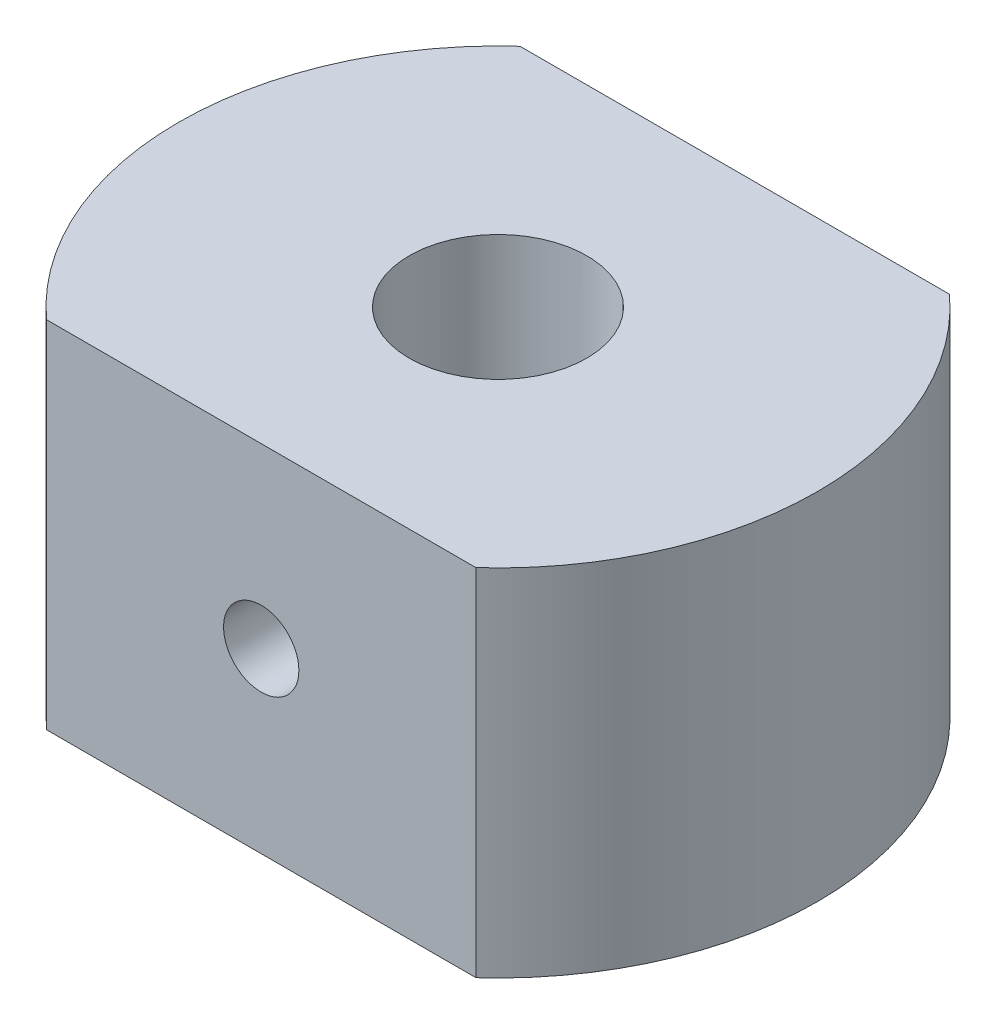
ISO-10303-21;
HEADER;
FILE_DESCRIPTION(('STEP AP214'),'2;1');
FILE_NAME('part.step','',(''),(''),'','','');
FILE_SCHEMA(('AUTOMOTIVE_DESIGN { 1 0 10303 214 1 1 1 1 }'));
ENDSEC;
DATA;
#1=APPLICATION_CONTEXT('core data for automotive mechanical design processes');
#2=APPLICATION_PROTOCOL_DEFINITION('international standard','automotive_design',2000,#1);
#3=PRODUCT_CONTEXT('',#1,'mechanical');
#4=PRODUCT('Part','Part','',(#3));
#5=PRODUCT_RELATED_PRODUCT_CATEGORY('part','',(#4));
#6=PRODUCT_DEFINITION_FORMATION('','',#4);
#7=PRODUCT_DEFINITION_CONTEXT('part definition',#1,'design');
#8=PRODUCT_DEFINITION('design','',#6,#7);
#9=PRODUCT_DEFINITION_SHAPE('','',#8);
#10=(LENGTH_UNIT() NAMED_UNIT(*) SI_UNIT(.MILLI.,.METRE.));
#11=(NAMED_UNIT(*) PLANE_ANGLE_UNIT() SI_UNIT($,.RADIAN.));
#12=(NAMED_UNIT(*) SI_UNIT($,.STERADIAN.) SOLID_ANGLE_UNIT());
#13=UNCERTAINTY_MEASURE_WITH_UNIT(LENGTH_MEASURE(1.E-05),#10,'distance_accuracy_value','');
#14=(GEOMETRIC_REPRESENTATION_CONTEXT(3) GLOBAL_UNCERTAINTY_ASSIGNED_CONTEXT((#13)) GLOBAL_UNIT_ASSIGNED_CONTEXT((#10,
#11,#12)) REPRESENTATION_CONTEXT('',''));
#15=CARTESIAN_POINT('',(0.,0.,0.));
#16=DIRECTION('',(0.,0.,1.));
#17=DIRECTION('',(1.,0.,0.));
#18=AXIS2_PLACEMENT_3D('',#15,#16,#17);
#19=CARTESIAN_POINT('',(0.,19.05,0.));
#20=DIRECTION('',(0.,-1.,0.));
#21=DIRECTION('',(0.,0.,-1.));
#22=AXIS2_PLACEMENT_3D('',#19,#20,#21);
#23=CYLINDRICAL_SURFACE('',#22,17.145);
#24=DIRECTION('',(0.,-1.,0.));
#25=VECTOR('',#24,1.);
#26=CARTESIAN_POINT('',(11.5178567884828,19.05,-12.7));
#27=LINE('',#26,#25);
#28=CARTESIAN_POINT('',(11.5178567884828,19.05,-12.7));
#29=VERTEX_POINT('',#28);
#30=CARTESIAN_POINT('',(11.5178567884828,0.,-12.7));
#31=VERTEX_POINT('',#30);
#32=EDGE_CURVE('E100',#29,#31,#27,.T.);
#33=ORIENTED_EDGE('',*,*,#32,.F.);
#34=CARTESIAN_POINT('',(0.,19.05,0.));
#35=DIRECTION('',(0.,1.,0.));
#36=DIRECTION('',(0.,0.,1.));
#37=AXIS2_PLACEMENT_3D('',#34,#35,#36);
#38=CIRCLE('',#37,17.145);
#39=CARTESIAN_POINT('',(11.5178567884828,19.05,12.7));
#40=VERTEX_POINT('',#39);
#41=EDGE_CURVE('E12',#40,#29,#38,.T.);
#42=ORIENTED_EDGE('',*,*,#41,.F.);
#43=DIRECTION('',(0.,-1.,0.));
#44=VECTOR('',#43,1.);
#45=CARTESIAN_POINT('',(11.5178567884828,19.05,12.7));
#46=LINE('',#45,#44);
#47=CARTESIAN_POINT('',(11.5178567884828,0.,12.7));
#48=VERTEX_POINT('',#47);
#49=EDGE_CURVE('E89',#48,#40,#46,.F.);
#50=ORIENTED_EDGE('',*,*,#49,.F.);
#51=CARTESIAN_POINT('',(0.,0.,0.));
#52=DIRECTION('',(0.,1.,0.));
#53=DIRECTION('',(0.,0.,1.));
#54=AXIS2_PLACEMENT_3D('',#51,#52,#53);
#55=CIRCLE('',#54,17.145);
#56=EDGE_CURVE('E57',#48,#31,#55,.T.);
#57=ORIENTED_EDGE('',*,*,#56,.T.);
#58=EDGE_LOOP('',(#33,#42,#50,#57));
#59=FACE_BOUND('',#58,.T.);
#60=ADVANCED_FACE('F33',(#59),#23,.T.);
#61=CARTESIAN_POINT('',(-11.5178567884828,0.,-12.7));
#62=VERTEX_POINT('',#61);
#63=CARTESIAN_POINT('',(-11.5178567884828,0.,12.7));
#64=VERTEX_POINT('',#63);
#65=EDGE_CURVE('E49',#62,#64,#55,.T.);
#66=ORIENTED_EDGE('',*,*,#65,.T.);
#67=DIRECTION('',(0.,-1.,0.));
#68=VECTOR('',#67,1.);
#69=CARTESIAN_POINT('',(-11.5178567884828,19.05,12.7));
#70=LINE('',#69,#68);
#71=CARTESIAN_POINT('',(-11.5178567884828,19.05,12.7));
#72=VERTEX_POINT('',#71);
#73=EDGE_CURVE('E87',#72,#64,#70,.T.);
#74=ORIENTED_EDGE('',*,*,#73,.F.);
#75=CARTESIAN_POINT('',(-11.5178567884828,19.05,-12.7));
#76=VERTEX_POINT('',#75);
#77=EDGE_CURVE('E41',#76,#72,#38,.T.);
#78=ORIENTED_EDGE('',*,*,#77,.F.);
#79=DIRECTION('',(0.,-1.,0.));
#80=VECTOR('',#79,1.);
#81=CARTESIAN_POINT('',(-11.5178567884828,19.05,-12.7));
#82=LINE('',#81,#80);
#83=EDGE_CURVE('E95',#62,#76,#82,.F.);
#84=ORIENTED_EDGE('',*,*,#83,.F.);
#85=EDGE_LOOP('',(#66,#74,#78,#84));
#86=FACE_BOUND('',#85,.T.);
#87=ADVANCED_FACE('F92',(#86),#23,.T.);
#88=CARTESIAN_POINT('',(0.,19.05,0.));
#89=DIRECTION('',(0.,1.,0.));
#90=DIRECTION('',(0.,0.,1.));
#91=AXIS2_PLACEMENT_3D('',#88,#89,#90);
#92=PLANE('',#91);
#93=CARTESIAN_POINT('',(0.,19.05,0.));
#94=DIRECTION('',(0.,1.,0.));
#95=DIRECTION('',(0.,0.,1.));
#96=AXIS2_PLACEMENT_3D('',#93,#94,#95);
#97=CIRCLE('',#96,4.7625);
#98=CARTESIAN_POINT('',(0.,19.05,4.7625));
#99=VERTEX_POINT('',#98);
#100=EDGE_CURVE('E106',#99,#99,#97,.T.);
#101=ORIENTED_EDGE('',*,*,#100,.F.);
#102=EDGE_LOOP('',(#101));
#103=FACE_BOUND('',#102,.T.);
#104=ORIENTED_EDGE('',*,*,#77,.T.);
#105=DIRECTION('',(1.,0.,0.));
#106=VECTOR('',#105,1.);
#107=CARTESIAN_POINT('',(-17.145,19.05,12.7));
#108=LINE('',#107,#106);
#109=EDGE_CURVE('E81',#72,#40,#108,.T.);
#110=ORIENTED_EDGE('',*,*,#109,.T.);
#111=ORIENTED_EDGE('',*,*,#41,.T.);
#112=DIRECTION('',(-1.,0.,0.));
#113=VECTOR('',#112,1.);
#114=CARTESIAN_POINT('',(-17.145,19.05,-12.7));
#115=LINE('',#114,#113);
#116=EDGE_CURVE('E84',#29,#76,#115,.T.);
#117=ORIENTED_EDGE('',*,*,#116,.T.);
#118=EDGE_LOOP('',(#104,#110,#111,#117));
#119=FACE_BOUND('',#118,.T.);
#120=ADVANCED_FACE('F80',(#103,#119),#92,.T.);
#121=CARTESIAN_POINT('',(0.,0.,0.));
#122=DIRECTION('',(0.,1.,0.));
#123=DIRECTION('',(0.,0.,1.));
#124=AXIS2_PLACEMENT_3D('',#121,#122,#123);
#125=PLANE('',#124);
#126=CARTESIAN_POINT('',(0.,0.,0.));
#127=DIRECTION('',(0.,1.,0.));
#128=DIRECTION('',(0.,0.,1.));
#129=AXIS2_PLACEMENT_3D('',#126,#127,#128);
#130=CIRCLE('',#129,4.7625);
#131=CARTESIAN_POINT('',(0.,0.,4.7625));
#132=VERTEX_POINT('',#131);
#133=EDGE_CURVE('E103',#132,#132,#130,.T.);
#134=ORIENTED_EDGE('',*,*,#133,.T.);
#135=EDGE_LOOP('',(#134));
#136=FACE_BOUND('',#135,.T.);
#137=DIRECTION('',(1.,0.,0.));
#138=VECTOR('',#137,1.);
#139=CARTESIAN_POINT('',(-17.145,0.,12.7));
#140=LINE('',#139,#138);
#141=EDGE_CURVE('E150',#64,#48,#140,.T.);
#142=ORIENTED_EDGE('',*,*,#141,.F.);
#143=ORIENTED_EDGE('',*,*,#65,.F.);
#144=DIRECTION('',(-1.,0.,0.));
#145=VECTOR('',#144,1.);
#146=CARTESIAN_POINT('',(-17.145,0.,-12.7));
#147=LINE('',#146,#145);
#148=EDGE_CURVE('E90',#31,#62,#147,.T.);
#149=ORIENTED_EDGE('',*,*,#148,.F.);
#150=ORIENTED_EDGE('',*,*,#56,.F.);
#151=EDGE_LOOP('',(#142,#143,#149,#150));
#152=FACE_BOUND('',#151,.T.);
#153=ADVANCED_FACE('F129',(#136,#152),#125,.F.);
#154=CARTESIAN_POINT('',(0.,9.525,-50.8));
#155=DIRECTION('',(0.,0.,1.));
#156=DIRECTION('',(1.,0.,0.));
#157=AXIS2_PLACEMENT_3D('',#154,#155,#156);
#158=CYLINDRICAL_SURFACE('',#157,2.0193);
#159=CARTESIAN_POINT('',(2.0193,9.525,-4.31321617357627));
#160=CARTESIAN_POINT('',(2.01929110374706,9.41748293676407,-4.31322500784682));
#161=CARTESIAN_POINT('',(2.01066084321028,9.30981288717604,-4.31729359492948));
#162=CARTESIAN_POINT('',(1.9764874964569,9.0975843370201,-4.33304009826462));
#163=CARTESIAN_POINT('',(1.95089924154244,8.99303492780961,-4.34473833525082));
#164=CARTESIAN_POINT('',(1.88399287898184,8.79051625775393,-4.37416225736717));
#165=CARTESIAN_POINT('',(1.8427404411322,8.69252150773558,-4.39186274624098));
#166=CARTESIAN_POINT('',(1.74587105896644,8.5048702073747,-4.43125985982862));
#167=CARTESIAN_POINT('',(1.69025715777373,8.4152118960491,-4.45295563768131));
#168=CARTESIAN_POINT('',(1.56240981495982,8.24094496246386,-4.49946283082396));
#169=CARTESIAN_POINT('',(1.48939451991757,8.15693848026367,-4.52438225881611));
#170=CARTESIAN_POINT('',(1.330457633739,8.00191576149239,-4.57364273721066));
#171=CARTESIAN_POINT('',(1.24453098650334,7.93090463818724,-4.59798355668516));
#172=CARTESIAN_POINT('',(1.0574437221698,7.8007784739908,-4.64466510279087));
#173=CARTESIAN_POINT('',(0.955770116211584,7.74234612873677,-4.66686571564726));
#174=CARTESIAN_POINT('',(0.742924215302888,7.64367685940121,-4.70543723475685));
#175=CARTESIAN_POINT('',(0.631756306881607,7.60343158607765,-4.72181081532365));
#176=CARTESIAN_POINT('',(0.409404370247119,7.54447735285553,-4.74611649179893));
#177=CARTESIAN_POINT('',(0.298541296141911,7.52472864691372,-4.75445440769268));
#178=CARTESIAN_POINT('',(0.0747825744101491,7.50396320047014,-4.76322673343662));
#179=CARTESIAN_POINT('',(-0.0381121976817063,7.50293857579909,-4.76366446982302));
#180=CARTESIAN_POINT('',(-0.255149328927894,7.51911700773496,-4.75682237766575));
#181=CARTESIAN_POINT('',(-0.359395126584831,7.53517617043442,-4.75002685606835));
#182=CARTESIAN_POINT('',(-0.563549103242388,7.58309852009277,-4.73015241176738));
#183=CARTESIAN_POINT('',(-0.663456961366336,7.6149628740005,-4.71707302510779));
#184=CARTESIAN_POINT('',(-0.857941199933671,7.69396237504655,-4.68563802872959));
#185=CARTESIAN_POINT('',(-0.952412672092121,7.74132361969344,-4.66720478405573));
#186=CARTESIAN_POINT('',(-1.13231541138298,7.84974608544132,-4.6268542768475));
#187=CARTESIAN_POINT('',(-1.21774343330275,7.91081220012941,-4.60493577065043));
#188=CARTESIAN_POINT('',(-1.38372923627481,8.05006375589506,-4.55792414045136));
#189=CARTESIAN_POINT('',(-1.46348272400714,8.12917040691293,-4.53271606660081));
#190=CARTESIAN_POINT('',(-1.60894685440403,8.29967212917618,-4.48314781333981));
#191=CARTESIAN_POINT('',(-1.67465168761736,8.39107225871288,-4.45878798817258));
#192=CARTESIAN_POINT('',(-1.79232295549791,8.58760165210156,-4.41283628949927));
#193=CARTESIAN_POINT('',(-1.84372708516444,8.6930998590068,-4.39137137236525));
#194=CARTESIAN_POINT('',(-1.9277086586156,8.91240631115646,-4.35516493590615));
#195=CARTESIAN_POINT('',(-1.96030011961023,9.02620829789978,-4.3404184124759));
#196=CARTESIAN_POINT('',(-2.00364610196248,9.25082202551601,-4.32057213659523));
#197=CARTESIAN_POINT('',(-2.01570844648017,9.3613294996527,-4.31489617703));
#198=CARTESIAN_POINT('',(-2.02150656229295,9.58291161968081,-4.31218443971668));
#199=CARTESIAN_POINT('',(-2.01524905836858,9.69398604251648,-4.31514549152573));
#200=CARTESIAN_POINT('',(-1.9857796717503,9.9056614711017,-4.32877712450799));
#201=CARTESIAN_POINT('',(-1.96373770351057,10.0064641129133,-4.33891519563437));
#202=CARTESIAN_POINT('',(-1.90489016269096,10.2028496477121,-4.36506914722584));
#203=CARTESIAN_POINT('',(-1.86808105688066,10.2984312852832,-4.381086434292));
#204=CARTESIAN_POINT('',(-1.7789908783356,10.4862663213644,-4.41803252929292));
#205=CARTESIAN_POINT('',(-1.72611180959561,10.5781991600938,-4.43914313531064));
#206=CARTESIAN_POINT('',(-1.60697058668266,10.7523384317747,-4.48364716457098));
#207=CARTESIAN_POINT('',(-1.54070249758578,10.8345405256823,-4.50704159777595));
#208=CARTESIAN_POINT('',(-1.39003959599186,10.9941497616923,-4.55587269406364));
#209=CARTESIAN_POINT('',(-1.3045836788228,11.0705578254153,-4.58131416933741));
#210=CARTESIAN_POINT('',(-1.12148339258769,11.2081398260767,-4.62953940477662));
#211=CARTESIAN_POINT('',(-1.02383793452483,11.2693124004333,-4.65232292713195));
#212=CARTESIAN_POINT('',(-0.818267914714745,11.3747015311528,-4.69285075220315));
#213=CARTESIAN_POINT('',(-0.710304055855965,11.4188497565086,-4.7105746747205));
#214=CARTESIAN_POINT('',(-0.487534115112742,11.4880238090711,-4.73880672086256));
#215=CARTESIAN_POINT('',(-0.372732313699731,11.5130614664252,-4.74931930816122));
#216=CARTESIAN_POINT('',(-0.148458396260826,11.5417756534458,-4.76141429209498));
#217=CARTESIAN_POINT('',(-0.0391969897359826,11.5468593014407,-4.76358471090499));
#218=CARTESIAN_POINT('',(0.178590408357317,11.539334380364,-4.76039525956455));
#219=CARTESIAN_POINT('',(0.287116533300415,11.5267291112262,-4.75503679395547));
#220=CARTESIAN_POINT('',(0.496125818541556,11.4851943333834,-4.73770629072151));
#221=CARTESIAN_POINT('',(0.59675795115101,11.4568982085649,-4.72599121869625));
#222=CARTESIAN_POINT('',(0.791799077661536,11.3854888154771,-4.6972531473272));
#223=CARTESIAN_POINT('',(0.886206907721936,11.3423727854449,-4.68022915869533));
#224=CARTESIAN_POINT('',(1.07085614019074,11.2403621860006,-4.64154895995872));
#225=CARTESIAN_POINT('',(1.16071269721103,11.1808391165402,-4.61971726995918));
#226=CARTESIAN_POINT('',(1.32954960213056,11.0486079500004,-4.57398811422751));
#227=CARTESIAN_POINT('',(1.40852572409303,10.9758947551653,-4.55008985167607));
#228=CARTESIAN_POINT('',(1.55918807882057,10.8132695680987,-4.50078467784592));
#229=CARTESIAN_POINT('',(1.62996109431015,10.722503932803,-4.475390870962));
#230=CARTESIAN_POINT('',(1.75542098130221,10.5296491447899,-4.42768799065369));
#231=CARTESIAN_POINT('',(1.81009864713684,10.4275535577385,-4.40538068639169));
#232=CARTESIAN_POINT('',(1.90134539479181,10.2147634653175,-4.36678027546454));
#233=CARTESIAN_POINT('',(1.93797277217725,10.1040979953562,-4.35046785160002));
#234=CARTESIAN_POINT('',(1.97824929459729,9.93426421332426,-4.33222071890415));
#235=CARTESIAN_POINT('',(1.9892271714489,9.87707064249135,-4.32717713250279));
#236=CARTESIAN_POINT('',(2.00620922974136,9.76180790153603,-4.31933158243512));
#237=CARTESIAN_POINT('',(2.01221681584378,9.7037393585805,-4.31652808434782));
#238=CARTESIAN_POINT('',(2.0181008333919,9.60539799058151,-4.3137773801375));
#239=CARTESIAN_POINT('',(2.01930332705896,9.56520969395213,-4.31321286969775));
#240=CARTESIAN_POINT('',(2.0193,9.525,-4.31321617357627));
#241=B_SPLINE_CURVE_WITH_KNOTS('',3,(#159,#160,#161,#162,#163,#164,#165,#166,#167,#168,#169,
#170,#171,#172,#173,#174,#175,#176,#177,#178,#179,#180,#181,#182,#183,#184,#185,#186,#187,#188,
#189,#190,#191,#192,#193,#194,#195,#196,#197,#198,#199,#200,#201,#202,#203,#204,#205,#206,#207,
#208,#209,#210,#211,#212,#213,#214,#215,#216,#217,#218,#219,#220,#221,#222,#223,#224,#225,#226,
#227,#228,#229,#230,#231,#232,#233,#234,#235,#236,#237,#238,#239,#240),.UNSPECIFIED.,.T.,.F.,(4,
2,2,2,2,2,2,2,2,2,2,2,2,2,2,2,2,2,2,2,2,2,2,2,2,2,2,2,2,2,2,2,2,2,2,2,2,2,2,2,4),(0.,
0.32240774760739,0.64567771886989,0.967607129297546,1.28946838036161,1.63015644524804,
1.97097827332822,2.32720365041864,2.6832653265655,3.02022094974152,3.35703468737582,
3.6726362923118,3.98826120261347,4.30871326427277,4.62927993206324,4.97312796410058,
5.31711791161203,5.67316574899681,6.02894795362536,6.36107482373721,6.6930797932642,
7.00273070387431,7.31245574673447,7.63551813438923,7.95872404067676,8.30936105230238,
8.66002941180441,9.01209095971419,9.36393439137057,9.69046664672362,10.0169379943581,
10.3311005347481,10.6453216526569,10.9738355236538,11.302476631146,11.654407125061,
12.0065385147928,12.3575250768451,12.5326811204118,12.707717082077,12.8282925188395),.UNSPECIFIED.);
#242=CARTESIAN_POINT('',(2.0193,9.525,-4.31321617357627));
#243=VERTEX_POINT('',#242);
#244=EDGE_CURVE('E102',#243,#243,#241,.T.);
#245=ORIENTED_EDGE('',*,*,#244,.F.);
#246=EDGE_LOOP('',(#245));
#247=FACE_BOUND('',#246,.T.);
#248=CARTESIAN_POINT('',(0.,9.525,-12.7));
#249=DIRECTION('',(0.,0.,-1.));
#250=DIRECTION('',(-1.,0.,0.));
#251=AXIS2_PLACEMENT_3D('',#248,#249,#250);
#252=CIRCLE('',#251,2.0193);
#253=CARTESIAN_POINT('',(-2.0193,9.525,-12.7));
#254=VERTEX_POINT('',#253);
#255=EDGE_CURVE('E36',#254,#254,#252,.F.);
#256=ORIENTED_EDGE('',*,*,#255,.F.);
#257=EDGE_LOOP('',(#256));
#258=FACE_BOUND('',#257,.T.);
#259=ADVANCED_FACE('F124',(#247,#258),#158,.F.);
#260=CARTESIAN_POINT('',(0.,7.5057,4.7625));
#261=CARTESIAN_POINT('',(0.107991496567345,7.5057041480405,4.76249669402768));
#262=CARTESIAN_POINT('',(0.216165198546214,7.51441393253757,4.75878535447878));
#263=CARTESIAN_POINT('',(0.429428346869618,7.54892090106755,4.74431067948027));
#264=CARTESIAN_POINT('',(0.534509183763363,7.57476179438442,4.73352930590862));
#265=CARTESIAN_POINT('',(0.738163416215698,7.64240706158452,4.70606441294083));
#266=CARTESIAN_POINT('',(0.836757822880156,7.68415658070965,4.68940118921749));
#267=CARTESIAN_POINT('',(1.02544436154111,7.78220100146872,4.65178867166375));
#268=CARTESIAN_POINT('',(1.1155388918147,7.83849178336452,4.63084059214083));
#269=CARTESIAN_POINT('',(1.28946535231427,7.96708695297789,4.58553597200015));
#270=CARTESIAN_POINT('',(1.37280136324168,8.04002149220087,4.56106525895698));
#271=CARTESIAN_POINT('',(1.52648801066348,8.19850005411637,4.51195772900846));
#272=CARTESIAN_POINT('',(1.59683158330901,8.28405089096419,4.48732082924961));
#273=CARTESIAN_POINT('',(1.72611202218087,8.47065666950489,4.4392509382189));
#274=CARTESIAN_POINT('',(1.78427731424354,8.57228229303612,4.41594480218955));
#275=CARTESIAN_POINT('',(1.88246665391315,8.78500430808006,4.37499449073841));
#276=CARTESIAN_POINT('',(1.92250037350019,8.89609561261854,4.35734729811954));
#277=CARTESIAN_POINT('',(1.98122377300505,9.11888641284391,4.3309531231867));
#278=CARTESIAN_POINT('',(2.00086975624937,9.23028502454521,4.32180969878174));
#279=CARTESIAN_POINT('',(2.02124136622949,9.45514386106173,4.3123229792902));
#280=CARTESIAN_POINT('',(2.02197796722129,9.56860285184857,4.31197457992163));
#281=CARTESIAN_POINT('',(2.00522829749944,9.78467659983735,4.31978298249343));
#282=CARTESIAN_POINT('',(1.98919364958509,9.88743336002839,4.32726229471122));
#283=CARTESIAN_POINT('',(1.94179809180933,10.088630293751,4.34873499411435));
#284=CARTESIAN_POINT('',(1.91043412230728,10.1870696012687,4.36272968170305));
#285=CARTESIAN_POINT('',(1.8326543897409,10.3793681765338,4.39597534219583));
#286=CARTESIAN_POINT('',(1.78592779932577,10.4730823671011,4.41533343757528));
#287=CARTESIAN_POINT('',(1.67896983107483,10.6517126536838,4.45710193306763));
#288=CARTESIAN_POINT('',(1.61873302403147,10.7366251925587,4.47951355884522));
#289=CARTESIAN_POINT('',(1.48025856784974,10.903089731251,4.52725679952809));
#290=CARTESIAN_POINT('',(1.40090473830624,10.9836919450158,4.5526720133063));
#291=CARTESIAN_POINT('',(1.22956364352471,11.1307698434973,4.60190395122921));
#292=CARTESIAN_POINT('',(1.13757321647958,11.197241982086,4.62572027308737));
#293=CARTESIAN_POINT('',(0.940596464011259,11.3156337191883,4.66980774129513));
#294=CARTESIAN_POINT('',(0.83534550666131,11.3671538313798,4.68997692814507));
#295=CARTESIAN_POINT('',(0.616596359200668,11.4514208063523,4.72370937726437));
#296=CARTESIAN_POINT('',(0.50310293529032,11.4841784226613,4.7372764228099));
#297=CARTESIAN_POINT('',(0.279016479415817,11.5279722025728,4.75556142676396));
#298=CARTESIAN_POINT('',(0.168714651611865,11.5402821835908,4.76079738649465));
#299=CARTESIAN_POINT('',(-0.0524945517070234,11.546645219007,4.7634935527998));
#300=CARTESIAN_POINT('',(-0.16340173545614,11.5407037541115,4.76095609364621));
#301=CARTESIAN_POINT('',(-0.37662103785295,11.5116326780002,4.74872479008353));
#302=CARTESIAN_POINT('',(-0.47908083463284,11.4894090822195,4.73940834130936));
#303=CARTESIAN_POINT('',(-0.678698309931927,11.4296783313229,4.71496485077418));
#304=CARTESIAN_POINT('',(-0.77585532291277,11.3921692627466,4.6998370815562));
#305=CARTESIAN_POINT('',(-0.965534123807483,11.3017110038739,4.66462750595782));
#306=CARTESIAN_POINT('',(-1.0578169005219,11.2483168203862,4.64440592871052));
#307=CARTESIAN_POINT('',(-1.23244470074898,11.1280914176747,4.60115121020693));
#308=CARTESIAN_POINT('',(-1.31478549135913,11.0612545071303,4.57811687972819));
#309=CARTESIAN_POINT('',(-1.47359087639881,10.9102703959181,4.52960607989361));
#310=CARTESIAN_POINT('',(-1.54917197840655,10.8252091559914,4.50407490840082));
#311=CARTESIAN_POINT('',(-1.68524673255161,10.6432253714301,4.45495185887478));
#312=CARTESIAN_POINT('',(-1.74573649442331,10.5462997779655,4.43136048193289));
#313=CARTESIAN_POINT('',(-1.85069822747416,10.341076200975,4.38857623083849));
#314=CARTESIAN_POINT('',(-1.89488980990074,10.232617130368,4.36946224750301));
#315=CARTESIAN_POINT('',(-1.96399411959868,10.008728672908,4.33884641556824));
#316=CARTESIAN_POINT('',(-1.98892350801851,9.89330540324158,4.32733798966791));
#317=CARTESIAN_POINT('',(-2.01711257896049,9.66860362364035,4.3142649844491));
#318=CARTESIAN_POINT('',(-2.02193063898001,9.5595614375942,4.31198572357338));
#319=CARTESIAN_POINT('',(-2.01395079467021,9.34227981156984,4.31571884097299));
#320=CARTESIAN_POINT('',(-2.00115583499945,9.23404024044678,4.3217298332305));
#321=CARTESIAN_POINT('',(-1.95963743454837,9.02701460837654,4.340703136793));
#322=CARTESIAN_POINT('',(-1.93174076953123,8.92802634155047,4.35330357255091));
#323=CARTESIAN_POINT('',(-1.8616353271243,8.7361209414581,4.3837395650058));
#324=CARTESIAN_POINT('',(-1.81942249890002,8.64320553542518,4.40157660323519));
#325=CARTESIAN_POINT('',(-1.71890850784438,8.4598628967305,4.44183042671409));
#326=CARTESIAN_POINT('',(-1.65977992714232,8.36993711472165,4.46446088617043));
#327=CARTESIAN_POINT('',(-1.52824930473833,8.20079694906198,4.51117806677482));
#328=CARTESIAN_POINT('',(-1.45584240251468,8.12158650626478,4.53526531901003));
#329=CARTESIAN_POINT('',(-1.29323824108728,7.9698814265585,4.5843957577329));
#330=CARTESIAN_POINT('',(-1.20210349782772,7.89836485229119,4.60937100070916));
#331=CARTESIAN_POINT('',(-1.00821068665197,7.77157580520775,4.6556242069008));
#332=CARTESIAN_POINT('',(-0.905447373116421,7.7163107041686,4.67690049046014));
#333=CARTESIAN_POINT('',(-0.692659735713411,7.62473436461269,4.71307722149484));
#334=CARTESIAN_POINT('',(-0.582771318551641,7.58814481370809,4.72807065497153));
#335=CARTESIAN_POINT('',(-0.357808090247951,7.53431133354263,4.75037520097883));
#336=CARTESIAN_POINT('',(-0.242750585870586,7.51700722141098,4.75771020813234));
#337=CARTESIAN_POINT('',(-0.106004696695082,7.5083718138479,4.76136796994465));
#338=CARTESIAN_POINT('',(-0.0848202117183729,7.5073707121142,4.76179183338671));
#339=CARTESIAN_POINT('',(-0.042426162203825,7.50603439610854,4.76235817384872));
#340=CARTESIAN_POINT('',(-0.021216597545325,7.50569918505337,4.76250064950933));
#341=CARTESIAN_POINT('',(0.,7.5057,4.7625));
#342=B_SPLINE_CURVE_WITH_KNOTS('',3,(#260,#261,#262,#263,#264,#265,#266,#267,#268,#269,#270,
#271,#272,#273,#274,#275,#276,#277,#278,#279,#280,#281,#282,#283,#284,#285,#286,#287,#288,#289,
#290,#291,#292,#293,#294,#295,#296,#297,#298,#299,#300,#301,#302,#303,#304,#305,#306,#307,#308,
#309,#310,#311,#312,#313,#314,#315,#316,#317,#318,#319,#320,#321,#322,#323,#324,#325,#326,#327,
#328,#329,#330,#331,#332,#333,#334,#335,#336,#337,#338,#339,#340,#341),.UNSPECIFIED.,.T.,.F.,(4,
2,2,2,2,2,2,2,2,2,2,2,2,2,2,2,2,2,2,2,2,2,2,2,2,2,2,2,2,2,2,2,2,2,2,2,2,2,2,2,4),(0.,
0.323886755682334,0.648603091367205,0.972209754049689,1.29572483490899,1.63450124685527,
1.97346130916379,2.32983345201897,2.68601526964395,3.02460980720925,3.36300783347956,
3.67436191720557,3.9857781707326,4.30392878667409,4.62220748423968,4.96843372609339,
5.31474675565451,5.66960370875051,6.02425707526075,6.35585139429207,6.68734614896859,
7.00167455700937,7.31604232528469,7.64021294988287,7.96452111037092,8.31278775690573,
8.66114408753037,9.01524108143888,9.36903144944862,9.69483136664731,10.0205768211235,
10.3300659685565,10.6396427607541,10.9681916656293,11.2968610765687,11.650686681129,
12.0046725366482,12.3532166617251,12.7006700344173,12.7643022829536,12.8279348388862),.UNSPECIFIED.);
#343=CARTESIAN_POINT('',(0.,7.5057,4.7625));
#344=VERTEX_POINT('',#343);
#345=EDGE_CURVE('E108',#344,#344,#342,.T.);
#346=ORIENTED_EDGE('',*,*,#345,.F.);
#347=EDGE_LOOP('',(#346));
#348=FACE_BOUND('',#347,.T.);
#349=CARTESIAN_POINT('',(0.,9.525,12.7));
#350=DIRECTION('',(0.,0.,1.));
#351=DIRECTION('',(1.,0.,0.));
#352=AXIS2_PLACEMENT_3D('',#349,#350,#351);
#353=CIRCLE('',#352,2.0193);
#354=CARTESIAN_POINT('',(2.0193,9.525,12.7));
#355=VERTEX_POINT('',#354);
#356=EDGE_CURVE('E96',#355,#355,#353,.F.);
#357=ORIENTED_EDGE('',*,*,#356,.F.);
#358=EDGE_LOOP('',(#357));
#359=FACE_BOUND('',#358,.T.);
#360=ADVANCED_FACE('F128',(#348,#359),#158,.F.);
#361=CARTESIAN_POINT('',(0.,0.,0.));
#362=DIRECTION('',(0.,1.,0.));
#363=DIRECTION('',(0.,0.,1.));
#364=AXIS2_PLACEMENT_3D('',#361,#362,#363);
#365=CYLINDRICAL_SURFACE('',#364,4.7625);
#366=ORIENTED_EDGE('',*,*,#345,.T.);
#367=EDGE_LOOP('',(#366));
#368=FACE_BOUND('',#367,.T.);
#369=ORIENTED_EDGE('',*,*,#244,.T.);
#370=EDGE_LOOP('',(#369));
#371=FACE_BOUND('',#370,.T.);
#372=ORIENTED_EDGE('',*,*,#133,.F.);
#373=EDGE_LOOP('',(#372));
#374=FACE_BOUND('',#373,.T.);
#375=ORIENTED_EDGE('',*,*,#100,.T.);
#376=EDGE_LOOP('',(#375));
#377=FACE_BOUND('',#376,.T.);
#378=ADVANCED_FACE('F121',(#368,#371,#374,#377),#365,.F.);
#379=CARTESIAN_POINT('',(-17.145,0.,12.7));
#380=DIRECTION('',(0.,0.,1.));
#381=DIRECTION('',(1.,0.,0.));
#382=AXIS2_PLACEMENT_3D('',#379,#380,#381);
#383=PLANE('',#382);
#384=ORIENTED_EDGE('',*,*,#356,.T.);
#385=EDGE_LOOP('',(#384));
#386=FACE_BOUND('',#385,.T.);
#387=ORIENTED_EDGE('',*,*,#73,.T.);
#388=ORIENTED_EDGE('',*,*,#141,.T.);
#389=ORIENTED_EDGE('',*,*,#49,.T.);
#390=ORIENTED_EDGE('',*,*,#109,.F.);
#391=EDGE_LOOP('',(#387,#388,#389,#390));
#392=FACE_BOUND('',#391,.T.);
#393=ADVANCED_FACE('F86',(#386,#392),#383,.T.);
#394=CARTESIAN_POINT('',(-17.145,0.,-12.7));
#395=DIRECTION('',(0.,0.,-1.));
#396=DIRECTION('',(-1.,0.,0.));
#397=AXIS2_PLACEMENT_3D('',#394,#395,#396);
#398=PLANE('',#397);
#399=ORIENTED_EDGE('',*,*,#255,.T.);
#400=EDGE_LOOP('',(#399));
#401=FACE_BOUND('',#400,.T.);
#402=ORIENTED_EDGE('',*,*,#32,.T.);
#403=ORIENTED_EDGE('',*,*,#148,.T.);
#404=ORIENTED_EDGE('',*,*,#83,.T.);
#405=ORIENTED_EDGE('',*,*,#116,.F.);
#406=EDGE_LOOP('',(#402,#403,#404,#405));
#407=FACE_BOUND('',#406,.T.);
#408=ADVANCED_FACE('F131',(#401,#407),#398,.T.);
#409=CLOSED_SHELL('',(#60,#87,#120,#153,#259,#360,#378,#393,#408));
#410=MANIFOLD_SOLID_BREP('B2',#409);
#411=ADVANCED_BREP_SHAPE_REPRESENTATION('',(#18,#410),#14);
#412=SHAPE_DEFINITION_REPRESENTATION(#9,#411);
ENDSEC;
END-ISO-10303-21;
